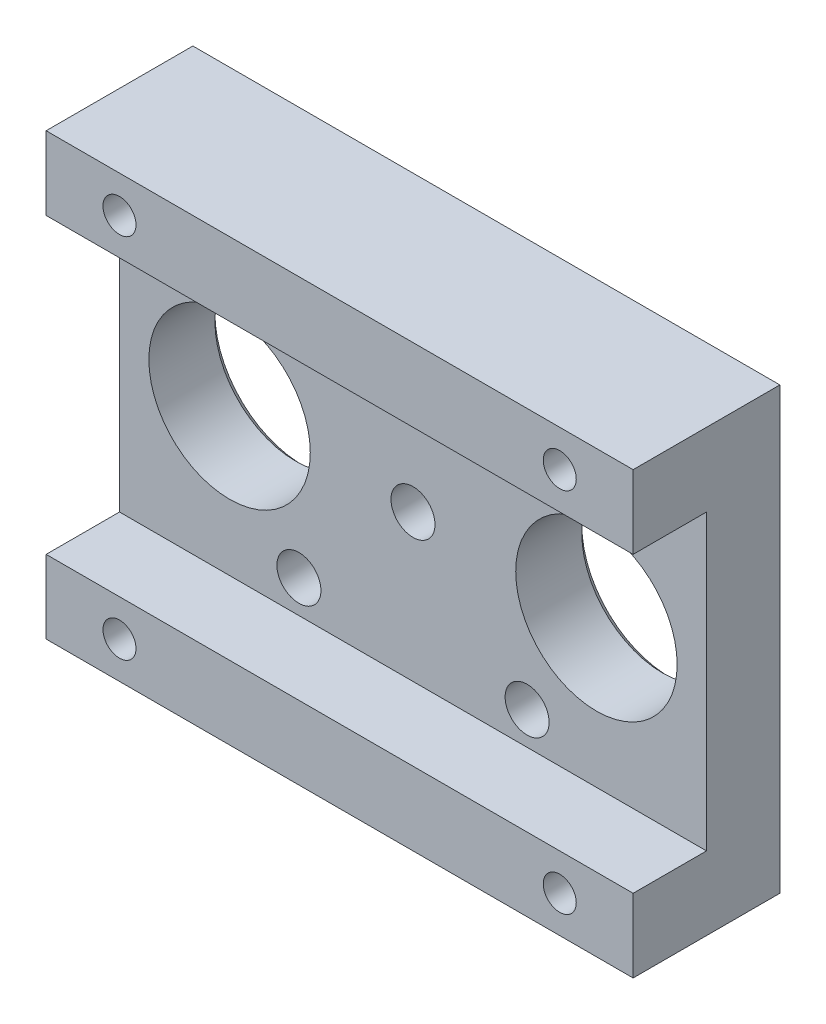
ISO-10303-21;
HEADER;
FILE_DESCRIPTION(('STEP AP214'),'2;1');
FILE_NAME('part.step','',(''),(''),'','','');
FILE_SCHEMA(('AUTOMOTIVE_DESIGN { 1 0 10303 214 1 1 1 1 }'));
ENDSEC;
DATA;
#1=APPLICATION_CONTEXT('core data for automotive mechanical design processes');
#2=APPLICATION_PROTOCOL_DEFINITION('international standard','automotive_design',2000,#1);
#3=PRODUCT_CONTEXT('',#1,'mechanical');
#4=PRODUCT('Part','Part','',(#3));
#5=PRODUCT_RELATED_PRODUCT_CATEGORY('part','',(#4));
#6=PRODUCT_DEFINITION_FORMATION('','',#4);
#7=PRODUCT_DEFINITION_CONTEXT('part definition',#1,'design');
#8=PRODUCT_DEFINITION('design','',#6,#7);
#9=PRODUCT_DEFINITION_SHAPE('','',#8);
#10=(LENGTH_UNIT() NAMED_UNIT(*) SI_UNIT(.MILLI.,.METRE.));
#11=(NAMED_UNIT(*) PLANE_ANGLE_UNIT() SI_UNIT($,.RADIAN.));
#12=(NAMED_UNIT(*) SI_UNIT($,.STERADIAN.) SOLID_ANGLE_UNIT());
#13=UNCERTAINTY_MEASURE_WITH_UNIT(LENGTH_MEASURE(1.E-05),#10,'distance_accuracy_value','');
#14=(GEOMETRIC_REPRESENTATION_CONTEXT(3) GLOBAL_UNCERTAINTY_ASSIGNED_CONTEXT((#13)) GLOBAL_UNIT_ASSIGNED_CONTEXT((#10,
#11,#12)) REPRESENTATION_CONTEXT('',''));
#15=CARTESIAN_POINT('',(0.,0.,0.));
#16=DIRECTION('',(0.,0.,1.));
#17=DIRECTION('',(1.,0.,0.));
#18=AXIS2_PLACEMENT_3D('',#15,#16,#17);
#19=CARTESIAN_POINT('',(-15.55,15.55,-2.2));
#20=DIRECTION('',(0.,0.,1.));
#21=DIRECTION('',(1.,0.,0.));
#22=AXIS2_PLACEMENT_3D('',#19,#20,#21);
#23=CYLINDRICAL_SURFACE('',#22,1.6);
#24=CARTESIAN_POINT('',(-15.55,15.55,0.));
#25=DIRECTION('',(0.,0.,1.));
#26=DIRECTION('',(1.,0.,0.));
#27=AXIS2_PLACEMENT_3D('',#24,#25,#26);
#28=CIRCLE('',#27,1.6);
#29=CARTESIAN_POINT('',(-13.95,15.55,0.));
#30=VERTEX_POINT('',#29);
#31=EDGE_CURVE('E206',#30,#30,#28,.T.);
#32=ORIENTED_EDGE('',*,*,#31,.F.);
#33=EDGE_LOOP('',(#32));
#34=FACE_BOUND('',#33,.T.);
#35=CARTESIAN_POINT('',(-15.55,15.55,4.));
#36=DIRECTION('',(0.,0.,1.));
#37=DIRECTION('',(1.,0.,0.));
#38=AXIS2_PLACEMENT_3D('',#35,#36,#37);
#39=CIRCLE('',#38,1.6);
#40=CARTESIAN_POINT('',(-13.95,15.55,4.));
#41=VERTEX_POINT('',#40);
#42=EDGE_CURVE('E211',#41,#41,#39,.F.);
#43=ORIENTED_EDGE('',*,*,#42,.F.);
#44=EDGE_LOOP('',(#43));
#45=FACE_BOUND('',#44,.T.);
#46=ADVANCED_FACE('F44',(#34,#45),#23,.F.);
#47=CARTESIAN_POINT('',(15.55,15.55,-2.2));
#48=DIRECTION('',(0.,0.,1.));
#49=DIRECTION('',(1.,0.,0.));
#50=AXIS2_PLACEMENT_3D('',#47,#48,#49);
#51=CYLINDRICAL_SURFACE('',#50,1.6);
#52=CARTESIAN_POINT('',(15.55,15.55,0.));
#53=DIRECTION('',(0.,0.,1.));
#54=DIRECTION('',(1.,0.,0.));
#55=AXIS2_PLACEMENT_3D('',#52,#53,#54);
#56=CIRCLE('',#55,1.6);
#57=CARTESIAN_POINT('',(17.15,15.55,0.));
#58=VERTEX_POINT('',#57);
#59=EDGE_CURVE('E210',#58,#58,#56,.T.);
#60=ORIENTED_EDGE('',*,*,#59,.F.);
#61=EDGE_LOOP('',(#60));
#62=FACE_BOUND('',#61,.T.);
#63=CARTESIAN_POINT('',(15.55,15.55,4.));
#64=DIRECTION('',(0.,0.,1.));
#65=DIRECTION('',(1.,0.,0.));
#66=AXIS2_PLACEMENT_3D('',#63,#64,#65);
#67=CIRCLE('',#66,1.6);
#68=CARTESIAN_POINT('',(17.15,15.55,4.));
#69=VERTEX_POINT('',#68);
#70=EDGE_CURVE('E233',#69,#69,#67,.F.);
#71=ORIENTED_EDGE('',*,*,#70,.F.);
#72=EDGE_LOOP('',(#71));
#73=FACE_BOUND('',#72,.T.);
#74=ADVANCED_FACE('F420',(#62,#73),#51,.F.);
#75=CARTESIAN_POINT('',(15.55,-15.55,-2.2));
#76=DIRECTION('',(0.,0.,1.));
#77=DIRECTION('',(1.,0.,0.));
#78=AXIS2_PLACEMENT_3D('',#75,#76,#77);
#79=CYLINDRICAL_SURFACE('',#78,1.6);
#80=CARTESIAN_POINT('',(15.55,-15.55,0.));
#81=DIRECTION('',(0.,0.,1.));
#82=DIRECTION('',(1.,0.,0.));
#83=AXIS2_PLACEMENT_3D('',#80,#81,#82);
#84=CIRCLE('',#83,1.6);
#85=CARTESIAN_POINT('',(17.15,-15.55,0.));
#86=VERTEX_POINT('',#85);
#87=EDGE_CURVE('E215',#86,#86,#84,.T.);
#88=ORIENTED_EDGE('',*,*,#87,.F.);
#89=EDGE_LOOP('',(#88));
#90=FACE_BOUND('',#89,.T.);
#91=CARTESIAN_POINT('',(15.55,-15.55,4.));
#92=DIRECTION('',(0.,0.,1.));
#93=DIRECTION('',(1.,0.,0.));
#94=AXIS2_PLACEMENT_3D('',#91,#92,#93);
#95=CIRCLE('',#94,1.6);
#96=CARTESIAN_POINT('',(17.15,-15.55,4.));
#97=VERTEX_POINT('',#96);
#98=EDGE_CURVE('E228',#97,#97,#95,.F.);
#99=ORIENTED_EDGE('',*,*,#98,.F.);
#100=EDGE_LOOP('',(#99));
#101=FACE_BOUND('',#100,.T.);
#102=ADVANCED_FACE('F426',(#90,#101),#79,.F.);
#103=CARTESIAN_POINT('',(-15.55,-15.55,-2.2));
#104=DIRECTION('',(0.,0.,1.));
#105=DIRECTION('',(1.,0.,0.));
#106=AXIS2_PLACEMENT_3D('',#103,#104,#105);
#107=CYLINDRICAL_SURFACE('',#106,1.6);
#108=CARTESIAN_POINT('',(-15.55,-15.55,0.));
#109=DIRECTION('',(0.,0.,1.));
#110=DIRECTION('',(1.,0.,0.));
#111=AXIS2_PLACEMENT_3D('',#108,#109,#110);
#112=CIRCLE('',#111,1.6);
#113=CARTESIAN_POINT('',(-13.95,-15.55,0.));
#114=VERTEX_POINT('',#113);
#115=EDGE_CURVE('E219',#114,#114,#112,.T.);
#116=ORIENTED_EDGE('',*,*,#115,.F.);
#117=EDGE_LOOP('',(#116));
#118=FACE_BOUND('',#117,.T.);
#119=CARTESIAN_POINT('',(-15.55,-15.55,4.));
#120=DIRECTION('',(0.,0.,1.));
#121=DIRECTION('',(1.,0.,0.));
#122=AXIS2_PLACEMENT_3D('',#119,#120,#121);
#123=CIRCLE('',#122,1.6);
#124=CARTESIAN_POINT('',(-13.95,-15.55,4.));
#125=VERTEX_POINT('',#124);
#126=EDGE_CURVE('E224',#125,#125,#123,.F.);
#127=ORIENTED_EDGE('',*,*,#126,.F.);
#128=EDGE_LOOP('',(#127));
#129=FACE_BOUND('',#128,.T.);
#130=ADVANCED_FACE('F385',(#118,#129),#107,.F.);
#131=CARTESIAN_POINT('',(0.,0.,10.));
#132=DIRECTION('',(0.,0.,1.));
#133=DIRECTION('',(1.,0.,0.));
#134=AXIS2_PLACEMENT_3D('',#131,#132,#133);
#135=PLANE('',#134);
#136=CARTESIAN_POINT('',(15.55,15.55,10.));
#137=DIRECTION('',(0.,0.,1.));
#138=DIRECTION('',(1.,0.,0.));
#139=AXIS2_PLACEMENT_3D('',#136,#137,#138);
#140=CIRCLE('',#139,3.);
#141=CARTESIAN_POINT('',(18.55,15.55,10.));
#142=VERTEX_POINT('',#141);
#143=EDGE_CURVE('E352',#142,#142,#140,.T.);
#144=ORIENTED_EDGE('',*,*,#143,.F.);
#145=EDGE_LOOP('',(#144));
#146=FACE_BOUND('',#145,.T.);
#147=CARTESIAN_POINT('',(-15.55,-15.55,10.));
#148=DIRECTION('',(0.,0.,1.));
#149=DIRECTION('',(1.,0.,0.));
#150=AXIS2_PLACEMENT_3D('',#147,#148,#149);
#151=CIRCLE('',#150,3.);
#152=CARTESIAN_POINT('',(-12.55,-15.55,10.));
#153=VERTEX_POINT('',#152);
#154=EDGE_CURVE('E360',#153,#153,#151,.T.);
#155=ORIENTED_EDGE('',*,*,#154,.F.);
#156=EDGE_LOOP('',(#155));
#157=FACE_BOUND('',#156,.T.);
#158=CARTESIAN_POINT('',(15.55,-15.55,10.));
#159=DIRECTION('',(0.,0.,1.));
#160=DIRECTION('',(1.,0.,0.));
#161=AXIS2_PLACEMENT_3D('',#158,#159,#160);
#162=CIRCLE('',#161,3.);
#163=CARTESIAN_POINT('',(18.55,-15.55,10.));
#164=VERTEX_POINT('',#163);
#165=EDGE_CURVE('E361',#164,#164,#162,.T.);
#166=ORIENTED_EDGE('',*,*,#165,.F.);
#167=EDGE_LOOP('',(#166));
#168=FACE_BOUND('',#167,.T.);
#169=CARTESIAN_POINT('',(-15.55,15.55,10.));
#170=DIRECTION('',(0.,0.,1.));
#171=DIRECTION('',(1.,0.,0.));
#172=AXIS2_PLACEMENT_3D('',#169,#170,#171);
#173=CIRCLE('',#172,3.);
#174=CARTESIAN_POINT('',(-12.55,15.55,10.));
#175=VERTEX_POINT('',#174);
#176=EDGE_CURVE('E348',#175,#175,#173,.T.);
#177=ORIENTED_EDGE('',*,*,#176,.F.);
#178=EDGE_LOOP('',(#177));
#179=FACE_BOUND('',#178,.T.);
#180=CARTESIAN_POINT('',(-25.,0.,10.));
#181=DIRECTION('',(0.,0.,1.));
#182=DIRECTION('',(1.,0.,0.));
#183=AXIS2_PLACEMENT_3D('',#180,#181,#182);
#184=CIRCLE('',#183,11.);
#185=CARTESIAN_POINT('',(-14.,0.,10.));
#186=VERTEX_POINT('',#185);
#187=EDGE_CURVE('E323',#186,#186,#184,.T.);
#188=ORIENTED_EDGE('',*,*,#187,.F.);
#189=EDGE_LOOP('',(#188));
#190=FACE_BOUND('',#189,.T.);
#191=CARTESIAN_POINT('',(25.,0.,10.));
#192=DIRECTION('',(0.,0.,1.));
#193=DIRECTION('',(1.,0.,0.));
#194=AXIS2_PLACEMENT_3D('',#191,#192,#193);
#195=CIRCLE('',#194,11.);
#196=CARTESIAN_POINT('',(36.,0.,10.));
#197=VERTEX_POINT('',#196);
#198=EDGE_CURVE('E223',#197,#197,#195,.T.);
#199=ORIENTED_EDGE('',*,*,#198,.F.);
#200=EDGE_LOOP('',(#199));
#201=FACE_BOUND('',#200,.T.);
#202=CARTESIAN_POINT('',(0.,0.,10.));
#203=DIRECTION('',(0.,0.,1.));
#204=DIRECTION('',(1.,0.,0.));
#205=AXIS2_PLACEMENT_3D('',#202,#203,#204);
#206=CIRCLE('',#205,3.);
#207=CARTESIAN_POINT('',(-3.,0.,10.));
#208=VERTEX_POINT('',#207);
#209=EDGE_CURVE('E200',#208,#208,#206,.T.);
#210=ORIENTED_EDGE('',*,*,#209,.F.);
#211=EDGE_LOOP('',(#210));
#212=FACE_BOUND('',#211,.T.);
#213=DIRECTION('',(0.,-1.,0.));
#214=VECTOR('',#213,1.);
#215=CARTESIAN_POINT('',(-40.,30.,10.));
#216=LINE('',#215,#214);
#217=CARTESIAN_POINT('',(-40.,20.,10.));
#218=VERTEX_POINT('',#217);
#219=CARTESIAN_POINT('',(-40.,-20.,10.));
#220=VERTEX_POINT('',#219);
#221=EDGE_CURVE('E66',#218,#220,#216,.T.);
#222=ORIENTED_EDGE('',*,*,#221,.T.);
#223=DIRECTION('',(-1.,0.,0.));
#224=VECTOR('',#223,1.);
#225=CARTESIAN_POINT('',(40.,-20.,10.));
#226=LINE('',#225,#224);
#227=CARTESIAN_POINT('',(40.,-20.,10.));
#228=VERTEX_POINT('',#227);
#229=EDGE_CURVE('E61',#228,#220,#226,.T.);
#230=ORIENTED_EDGE('',*,*,#229,.F.);
#231=DIRECTION('',(0.,1.,0.));
#232=VECTOR('',#231,1.);
#233=CARTESIAN_POINT('',(40.,30.,10.));
#234=LINE('',#233,#232);
#235=CARTESIAN_POINT('',(40.,20.,10.));
#236=VERTEX_POINT('',#235);
#237=EDGE_CURVE('E174',#228,#236,#234,.T.);
#238=ORIENTED_EDGE('',*,*,#237,.T.);
#239=DIRECTION('',(1.,0.,0.));
#240=VECTOR('',#239,1.);
#241=CARTESIAN_POINT('',(-40.,20.,10.));
#242=LINE('',#241,#240);
#243=EDGE_CURVE('E142',#218,#236,#242,.T.);
#244=ORIENTED_EDGE('',*,*,#243,.F.);
#245=EDGE_LOOP('',(#222,#230,#238,#244));
#246=FACE_BOUND('',#245,.T.);
#247=ADVANCED_FACE('F382',(#146,#157,#168,#179,#190,#201,#212,#246),#135,.T.);
#248=CARTESIAN_POINT('',(40.,30.,10.));
#249=DIRECTION('',(-1.,0.,0.));
#250=DIRECTION('',(0.,-1.,0.));
#251=AXIS2_PLACEMENT_3D('',#248,#249,#250);
#252=PLANE('',#251);
#253=DIRECTION('',(0.,1.,0.));
#254=VECTOR('',#253,1.);
#255=CARTESIAN_POINT('',(40.,30.,0.));
#256=LINE('',#255,#254);
#257=CARTESIAN_POINT('',(40.,-30.,0.));
#258=VERTEX_POINT('',#257);
#259=CARTESIAN_POINT('',(40.,30.,0.));
#260=VERTEX_POINT('',#259);
#261=EDGE_CURVE('E173',#258,#260,#256,.T.);
#262=ORIENTED_EDGE('',*,*,#261,.T.);
#263=DIRECTION('',(0.,0.,-1.));
#264=VECTOR('',#263,1.);
#265=CARTESIAN_POINT('',(40.,30.,10.));
#266=LINE('',#265,#264);
#267=CARTESIAN_POINT('',(40.,30.,20.));
#268=VERTEX_POINT('',#267);
#269=EDGE_CURVE('E195',#268,#260,#266,.T.);
#270=ORIENTED_EDGE('',*,*,#269,.F.);
#271=DIRECTION('',(0.,1.,0.));
#272=VECTOR('',#271,1.);
#273=CARTESIAN_POINT('',(40.,30.,20.));
#274=LINE('',#273,#272);
#275=CARTESIAN_POINT('',(40.,20.,20.));
#276=VERTEX_POINT('',#275);
#277=EDGE_CURVE('E154',#276,#268,#274,.T.);
#278=ORIENTED_EDGE('',*,*,#277,.F.);
#279=DIRECTION('',(0.,0.,-1.));
#280=VECTOR('',#279,1.);
#281=CARTESIAN_POINT('',(40.,20.,20.));
#282=LINE('',#281,#280);
#283=EDGE_CURVE('E162',#276,#236,#282,.T.);
#284=ORIENTED_EDGE('',*,*,#283,.T.);
#285=ORIENTED_EDGE('',*,*,#237,.F.);
#286=DIRECTION('',(0.,0.,-1.));
#287=VECTOR('',#286,1.);
#288=CARTESIAN_POINT('',(40.,-20.,20.));
#289=LINE('',#288,#287);
#290=CARTESIAN_POINT('',(40.,-20.,20.));
#291=VERTEX_POINT('',#290);
#292=EDGE_CURVE('E136',#291,#228,#289,.T.);
#293=ORIENTED_EDGE('',*,*,#292,.F.);
#294=DIRECTION('',(0.,1.,0.));
#295=VECTOR('',#294,1.);
#296=CARTESIAN_POINT('',(40.,-30.,20.));
#297=LINE('',#296,#295);
#298=CARTESIAN_POINT('',(40.,-30.,20.));
#299=VERTEX_POINT('',#298);
#300=EDGE_CURVE('E127',#299,#291,#297,.T.);
#301=ORIENTED_EDGE('',*,*,#300,.F.);
#302=DIRECTION('',(0.,0.,-1.));
#303=VECTOR('',#302,1.);
#304=CARTESIAN_POINT('',(40.,-30.,10.));
#305=LINE('',#304,#303);
#306=EDGE_CURVE('E109',#299,#258,#305,.T.);
#307=ORIENTED_EDGE('',*,*,#306,.T.);
#308=EDGE_LOOP('',(#262,#270,#278,#284,#285,#293,#301,#307));
#309=FACE_BOUND('',#308,.T.);
#310=ADVANCED_FACE('F134',(#309),#252,.F.);
#311=CARTESIAN_POINT('',(-40.,30.,10.));
#312=DIRECTION('',(0.,-1.,0.));
#313=DIRECTION('',(0.,0.,-1.));
#314=AXIS2_PLACEMENT_3D('',#311,#312,#313);
#315=PLANE('',#314);
#316=DIRECTION('',(-1.,0.,0.));
#317=VECTOR('',#316,1.);
#318=CARTESIAN_POINT('',(-40.,30.,0.));
#319=LINE('',#318,#317);
#320=CARTESIAN_POINT('',(-40.,30.,0.));
#321=VERTEX_POINT('',#320);
#322=EDGE_CURVE('E181',#260,#321,#319,.T.);
#323=ORIENTED_EDGE('',*,*,#322,.T.);
#324=DIRECTION('',(0.,0.,-1.));
#325=VECTOR('',#324,1.);
#326=CARTESIAN_POINT('',(-40.,30.,10.));
#327=LINE('',#326,#325);
#328=CARTESIAN_POINT('',(-40.,30.,20.));
#329=VERTEX_POINT('',#328);
#330=EDGE_CURVE('E191',#329,#321,#327,.T.);
#331=ORIENTED_EDGE('',*,*,#330,.F.);
#332=DIRECTION('',(-1.,0.,0.));
#333=VECTOR('',#332,1.);
#334=CARTESIAN_POINT('',(-40.,30.,20.));
#335=LINE('',#334,#333);
#336=EDGE_CURVE('E158',#268,#329,#335,.T.);
#337=ORIENTED_EDGE('',*,*,#336,.F.);
#338=ORIENTED_EDGE('',*,*,#269,.T.);
#339=EDGE_LOOP('',(#323,#331,#337,#338));
#340=FACE_BOUND('',#339,.T.);
#341=ADVANCED_FACE('F285',(#340),#315,.F.);
#342=CARTESIAN_POINT('',(-40.,30.,10.));
#343=DIRECTION('',(1.,0.,0.));
#344=DIRECTION('',(0.,1.,0.));
#345=AXIS2_PLACEMENT_3D('',#342,#343,#344);
#346=PLANE('',#345);
#347=DIRECTION('',(0.,-1.,0.));
#348=VECTOR('',#347,1.);
#349=CARTESIAN_POINT('',(-40.,30.,0.));
#350=LINE('',#349,#348);
#351=CARTESIAN_POINT('',(-40.,-30.,0.));
#352=VERTEX_POINT('',#351);
#353=EDGE_CURVE('E184',#321,#352,#350,.T.);
#354=ORIENTED_EDGE('',*,*,#353,.T.);
#355=DIRECTION('',(0.,0.,-1.));
#356=VECTOR('',#355,1.);
#357=CARTESIAN_POINT('',(-40.,-30.,10.));
#358=LINE('',#357,#356);
#359=CARTESIAN_POINT('',(-40.,-30.,20.));
#360=VERTEX_POINT('',#359);
#361=EDGE_CURVE('E121',#360,#352,#358,.T.);
#362=ORIENTED_EDGE('',*,*,#361,.F.);
#363=DIRECTION('',(0.,-1.,0.));
#364=VECTOR('',#363,1.);
#365=CARTESIAN_POINT('',(-40.,-30.,20.));
#366=LINE('',#365,#364);
#367=CARTESIAN_POINT('',(-40.,-20.,20.));
#368=VERTEX_POINT('',#367);
#369=EDGE_CURVE('E130',#368,#360,#366,.T.);
#370=ORIENTED_EDGE('',*,*,#369,.F.);
#371=DIRECTION('',(0.,0.,-1.));
#372=VECTOR('',#371,1.);
#373=CARTESIAN_POINT('',(-40.,-20.,20.));
#374=LINE('',#373,#372);
#375=EDGE_CURVE('E132',#368,#220,#374,.T.);
#376=ORIENTED_EDGE('',*,*,#375,.T.);
#377=ORIENTED_EDGE('',*,*,#221,.F.);
#378=DIRECTION('',(0.,0.,-1.));
#379=VECTOR('',#378,1.);
#380=CARTESIAN_POINT('',(-40.,20.,20.));
#381=LINE('',#380,#379);
#382=CARTESIAN_POINT('',(-40.,20.,20.));
#383=VERTEX_POINT('',#382);
#384=EDGE_CURVE('E169',#383,#218,#381,.T.);
#385=ORIENTED_EDGE('',*,*,#384,.F.);
#386=DIRECTION('',(0.,-1.,0.));
#387=VECTOR('',#386,1.);
#388=CARTESIAN_POINT('',(-40.,30.,20.));
#389=LINE('',#388,#387);
#390=EDGE_CURVE('E147',#329,#383,#389,.T.);
#391=ORIENTED_EDGE('',*,*,#390,.F.);
#392=ORIENTED_EDGE('',*,*,#330,.T.);
#393=EDGE_LOOP('',(#354,#362,#370,#376,#377,#385,#391,#392));
#394=FACE_BOUND('',#393,.T.);
#395=ADVANCED_FACE('F287',(#394),#346,.F.);
#396=CARTESIAN_POINT('',(-40.,-30.,10.));
#397=DIRECTION('',(0.,1.,0.));
#398=DIRECTION('',(0.,0.,1.));
#399=AXIS2_PLACEMENT_3D('',#396,#397,#398);
#400=PLANE('',#399);
#401=DIRECTION('',(1.,0.,0.));
#402=VECTOR('',#401,1.);
#403=CARTESIAN_POINT('',(-40.,-30.,0.));
#404=LINE('',#403,#402);
#405=EDGE_CURVE('E115',#352,#258,#404,.T.);
#406=ORIENTED_EDGE('',*,*,#405,.T.);
#407=ORIENTED_EDGE('',*,*,#306,.F.);
#408=DIRECTION('',(1.,0.,0.));
#409=VECTOR('',#408,1.);
#410=CARTESIAN_POINT('',(40.,-30.,20.));
#411=LINE('',#410,#409);
#412=EDGE_CURVE('E113',#360,#299,#411,.T.);
#413=ORIENTED_EDGE('',*,*,#412,.F.);
#414=ORIENTED_EDGE('',*,*,#361,.T.);
#415=EDGE_LOOP('',(#406,#407,#413,#414));
#416=FACE_BOUND('',#415,.T.);
#417=ADVANCED_FACE('F111',(#416),#400,.F.);
#418=CARTESIAN_POINT('',(0.,0.,0.));
#419=DIRECTION('',(0.,0.,1.));
#420=DIRECTION('',(1.,0.,0.));
#421=AXIS2_PLACEMENT_3D('',#418,#419,#420);
#422=PLANE('',#421);
#423=CARTESIAN_POINT('',(25.,0.,0.));
#424=DIRECTION('',(0.,0.,1.));
#425=DIRECTION('',(1.,0.,0.));
#426=AXIS2_PLACEMENT_3D('',#423,#424,#425);
#427=CIRCLE('',#426,12.);
#428=CARTESIAN_POINT('',(37.,0.,0.));
#429=VERTEX_POINT('',#428);
#430=EDGE_CURVE('E243',#429,#429,#427,.T.);
#431=ORIENTED_EDGE('',*,*,#430,.T.);
#432=EDGE_LOOP('',(#431));
#433=FACE_BOUND('',#432,.T.);
#434=CARTESIAN_POINT('',(-25.,0.,0.));
#435=DIRECTION('',(0.,0.,1.));
#436=DIRECTION('',(1.,0.,0.));
#437=AXIS2_PLACEMENT_3D('',#434,#435,#436);
#438=CIRCLE('',#437,12.);
#439=CARTESIAN_POINT('',(-13.,0.,0.));
#440=VERTEX_POINT('',#439);
#441=EDGE_CURVE('E199',#440,#440,#438,.T.);
#442=ORIENTED_EDGE('',*,*,#441,.T.);
#443=EDGE_LOOP('',(#442));
#444=FACE_BOUND('',#443,.T.);
#445=ORIENTED_EDGE('',*,*,#115,.T.);
#446=EDGE_LOOP('',(#445));
#447=FACE_BOUND('',#446,.T.);
#448=ORIENTED_EDGE('',*,*,#87,.T.);
#449=EDGE_LOOP('',(#448));
#450=FACE_BOUND('',#449,.T.);
#451=ORIENTED_EDGE('',*,*,#59,.T.);
#452=EDGE_LOOP('',(#451));
#453=FACE_BOUND('',#452,.T.);
#454=ORIENTED_EDGE('',*,*,#31,.T.);
#455=EDGE_LOOP('',(#454));
#456=FACE_BOUND('',#455,.T.);
#457=CARTESIAN_POINT('',(0.,0.,0.));
#458=DIRECTION('',(0.,0.,-1.));
#459=DIRECTION('',(-1.,0.,0.));
#460=AXIS2_PLACEMENT_3D('',#457,#458,#459);
#461=CIRCLE('',#460,11.35);
#462=CARTESIAN_POINT('',(-11.35,0.,0.));
#463=VERTEX_POINT('',#462);
#464=EDGE_CURVE('E204',#463,#463,#461,.T.);
#465=ORIENTED_EDGE('',*,*,#464,.F.);
#466=EDGE_LOOP('',(#465));
#467=FACE_BOUND('',#466,.T.);
#468=ORIENTED_EDGE('',*,*,#261,.F.);
#469=ORIENTED_EDGE('',*,*,#405,.F.);
#470=ORIENTED_EDGE('',*,*,#353,.F.);
#471=ORIENTED_EDGE('',*,*,#322,.F.);
#472=EDGE_LOOP('',(#468,#469,#470,#471));
#473=FACE_BOUND('',#472,.T.);
#474=ADVANCED_FACE('F259',(#433,#444,#447,#450,#453,#456,#467,#473),#422,.F.);
#475=CARTESIAN_POINT('',(-40.,20.,20.));
#476=DIRECTION('',(0.,1.,0.));
#477=DIRECTION('',(-1.,0.,0.));
#478=AXIS2_PLACEMENT_3D('',#475,#476,#477);
#479=PLANE('',#478);
#480=ORIENTED_EDGE('',*,*,#243,.T.);
#481=ORIENTED_EDGE('',*,*,#283,.F.);
#482=DIRECTION('',(1.,0.,0.));
#483=VECTOR('',#482,1.);
#484=CARTESIAN_POINT('',(-40.,20.,20.));
#485=LINE('',#484,#483);
#486=EDGE_CURVE('E151',#383,#276,#485,.T.);
#487=ORIENTED_EDGE('',*,*,#486,.F.);
#488=ORIENTED_EDGE('',*,*,#384,.T.);
#489=EDGE_LOOP('',(#480,#481,#487,#488));
#490=FACE_BOUND('',#489,.T.);
#491=ADVANCED_FACE('F262',(#490),#479,.F.);
#492=CARTESIAN_POINT('',(0.,0.,20.));
#493=DIRECTION('',(0.,0.,1.));
#494=DIRECTION('',(1.,0.,0.));
#495=AXIS2_PLACEMENT_3D('',#492,#493,#494);
#496=PLANE('',#495);
#497=CARTESIAN_POINT('',(-30.,25.,20.));
#498=DIRECTION('',(0.,0.,1.));
#499=DIRECTION('',(1.,0.,0.));
#500=AXIS2_PLACEMENT_3D('',#497,#498,#499);
#501=CIRCLE('',#500,2.25);
#502=CARTESIAN_POINT('',(-27.75,25.,20.));
#503=VERTEX_POINT('',#502);
#504=EDGE_CURVE('E314',#503,#503,#501,.T.);
#505=ORIENTED_EDGE('',*,*,#504,.F.);
#506=EDGE_LOOP('',(#505));
#507=FACE_BOUND('',#506,.T.);
#508=CARTESIAN_POINT('',(30.,25.,20.));
#509=DIRECTION('',(0.,0.,1.));
#510=DIRECTION('',(1.,0.,0.));
#511=AXIS2_PLACEMENT_3D('',#508,#509,#510);
#512=CIRCLE('',#511,2.25);
#513=CARTESIAN_POINT('',(32.25,25.,20.));
#514=VERTEX_POINT('',#513);
#515=EDGE_CURVE('E310',#514,#514,#512,.T.);
#516=ORIENTED_EDGE('',*,*,#515,.F.);
#517=EDGE_LOOP('',(#516));
#518=FACE_BOUND('',#517,.T.);
#519=ORIENTED_EDGE('',*,*,#390,.T.);
#520=ORIENTED_EDGE('',*,*,#486,.T.);
#521=ORIENTED_EDGE('',*,*,#277,.T.);
#522=ORIENTED_EDGE('',*,*,#336,.T.);
#523=EDGE_LOOP('',(#519,#520,#521,#522));
#524=FACE_BOUND('',#523,.T.);
#525=ADVANCED_FACE('F282',(#507,#518,#524),#496,.T.);
#526=CARTESIAN_POINT('',(40.,-20.,20.));
#527=DIRECTION('',(0.,-1.,0.));
#528=DIRECTION('',(1.,0.,0.));
#529=AXIS2_PLACEMENT_3D('',#526,#527,#528);
#530=PLANE('',#529);
#531=ORIENTED_EDGE('',*,*,#229,.T.);
#532=ORIENTED_EDGE('',*,*,#375,.F.);
#533=DIRECTION('',(-1.,0.,0.));
#534=VECTOR('',#533,1.);
#535=CARTESIAN_POINT('',(40.,-20.,20.));
#536=LINE('',#535,#534);
#537=EDGE_CURVE('E138',#291,#368,#536,.T.);
#538=ORIENTED_EDGE('',*,*,#537,.F.);
#539=ORIENTED_EDGE('',*,*,#292,.T.);
#540=EDGE_LOOP('',(#531,#532,#538,#539));
#541=FACE_BOUND('',#540,.T.);
#542=ADVANCED_FACE('F292',(#541),#530,.F.);
#543=CARTESIAN_POINT('',(0.,0.,20.));
#544=DIRECTION('',(0.,0.,1.));
#545=DIRECTION('',(1.,0.,0.));
#546=AXIS2_PLACEMENT_3D('',#543,#544,#545);
#547=PLANE('',#546);
#548=CARTESIAN_POINT('',(30.,-25.,20.));
#549=DIRECTION('',(0.,0.,1.));
#550=DIRECTION('',(1.,0.,0.));
#551=AXIS2_PLACEMENT_3D('',#548,#549,#550);
#552=CIRCLE('',#551,2.25);
#553=CARTESIAN_POINT('',(32.25,-25.,20.));
#554=VERTEX_POINT('',#553);
#555=EDGE_CURVE('E322',#554,#554,#552,.T.);
#556=ORIENTED_EDGE('',*,*,#555,.F.);
#557=EDGE_LOOP('',(#556));
#558=FACE_BOUND('',#557,.T.);
#559=CARTESIAN_POINT('',(-30.,-25.,20.));
#560=DIRECTION('',(0.,0.,1.));
#561=DIRECTION('',(1.,0.,0.));
#562=AXIS2_PLACEMENT_3D('',#559,#560,#561);
#563=CIRCLE('',#562,2.25);
#564=CARTESIAN_POINT('',(-27.75,-25.,20.));
#565=VERTEX_POINT('',#564);
#566=EDGE_CURVE('E331',#565,#565,#563,.T.);
#567=ORIENTED_EDGE('',*,*,#566,.F.);
#568=EDGE_LOOP('',(#567));
#569=FACE_BOUND('',#568,.T.);
#570=ORIENTED_EDGE('',*,*,#300,.T.);
#571=ORIENTED_EDGE('',*,*,#537,.T.);
#572=ORIENTED_EDGE('',*,*,#369,.T.);
#573=ORIENTED_EDGE('',*,*,#412,.T.);
#574=EDGE_LOOP('',(#570,#571,#572,#573));
#575=FACE_BOUND('',#574,.T.);
#576=ADVANCED_FACE('F126',(#558,#569,#575),#547,.T.);
#577=CARTESIAN_POINT('',(0.,0.,2.2));
#578=DIRECTION('',(0.,0.,-1.));
#579=DIRECTION('',(-1.,0.,0.));
#580=AXIS2_PLACEMENT_3D('',#577,#578,#579);
#581=CYLINDRICAL_SURFACE('',#580,11.35);
#582=CARTESIAN_POINT('',(0.,0.,2.2));
#583=DIRECTION('',(0.,0.,-1.));
#584=DIRECTION('',(-1.,0.,0.));
#585=AXIS2_PLACEMENT_3D('',#582,#583,#584);
#586=CIRCLE('',#585,11.35);
#587=CARTESIAN_POINT('',(-11.35,0.,2.2));
#588=VERTEX_POINT('',#587);
#589=EDGE_CURVE('E295',#588,#588,#586,.T.);
#590=ORIENTED_EDGE('',*,*,#589,.F.);
#591=EDGE_LOOP('',(#590));
#592=FACE_BOUND('',#591,.T.);
#593=ORIENTED_EDGE('',*,*,#464,.T.);
#594=EDGE_LOOP('',(#593));
#595=FACE_BOUND('',#594,.T.);
#596=ADVANCED_FACE('F406',(#592,#595),#581,.F.);
#597=CARTESIAN_POINT('',(0.,0.,2.2));
#598=DIRECTION('',(0.,0.,-1.));
#599=DIRECTION('',(-1.,0.,0.));
#600=AXIS2_PLACEMENT_3D('',#597,#598,#599);
#601=PLANE('',#600);
#602=CARTESIAN_POINT('',(0.,0.,2.2));
#603=DIRECTION('',(0.,0.,-1.));
#604=DIRECTION('',(-1.,0.,0.));
#605=AXIS2_PLACEMENT_3D('',#602,#603,#604);
#606=CIRCLE('',#605,3.);
#607=CARTESIAN_POINT('',(-3.,0.,2.2));
#608=VERTEX_POINT('',#607);
#609=EDGE_CURVE('E205',#608,#608,#606,.T.);
#610=ORIENTED_EDGE('',*,*,#609,.F.);
#611=EDGE_LOOP('',(#610));
#612=FACE_BOUND('',#611,.T.);
#613=ORIENTED_EDGE('',*,*,#589,.T.);
#614=EDGE_LOOP('',(#613));
#615=FACE_BOUND('',#614,.T.);
#616=ADVANCED_FACE('F400',(#612,#615),#601,.T.);
#617=CARTESIAN_POINT('',(0.,0.,14.4));
#618=DIRECTION('',(0.,0.,-1.));
#619=DIRECTION('',(-1.,0.,0.));
#620=AXIS2_PLACEMENT_3D('',#617,#618,#619);
#621=CYLINDRICAL_SURFACE('',#620,3.);
#622=CARTESIAN_POINT('',(-3.,0.,10.));
#623=CARTESIAN_POINT('',(-3.,0.,9.91875));
#624=CARTESIAN_POINT('',(-3.,0.,9.8375));
#625=CARTESIAN_POINT('',(-3.,0.,9.675));
#626=CARTESIAN_POINT('',(-3.,0.,9.59375));
#627=CARTESIAN_POINT('',(-3.,0.,9.43125));
#628=CARTESIAN_POINT('',(-3.,0.,9.35));
#629=CARTESIAN_POINT('',(-3.,0.,9.1875));
#630=CARTESIAN_POINT('',(-3.,0.,9.10625));
#631=CARTESIAN_POINT('',(-3.,0.,8.94375));
#632=CARTESIAN_POINT('',(-3.,0.,8.8625));
#633=CARTESIAN_POINT('',(-3.,0.,8.7));
#634=CARTESIAN_POINT('',(-3.,0.,8.61875));
#635=CARTESIAN_POINT('',(-3.,0.,8.45625));
#636=CARTESIAN_POINT('',(-3.,0.,8.375));
#637=CARTESIAN_POINT('',(-3.,0.,8.2125));
#638=CARTESIAN_POINT('',(-3.,0.,8.13125));
#639=CARTESIAN_POINT('',(-3.,0.,7.96875));
#640=CARTESIAN_POINT('',(-3.,0.,7.8875));
#641=CARTESIAN_POINT('',(-3.,0.,7.725));
#642=CARTESIAN_POINT('',(-3.,0.,7.64375));
#643=CARTESIAN_POINT('',(-3.,0.,7.48125));
#644=CARTESIAN_POINT('',(-3.,0.,7.4));
#645=CARTESIAN_POINT('',(-3.,0.,7.2375));
#646=CARTESIAN_POINT('',(-3.,0.,7.15625));
#647=CARTESIAN_POINT('',(-3.,0.,6.99375));
#648=CARTESIAN_POINT('',(-3.,0.,6.9125));
#649=CARTESIAN_POINT('',(-3.,0.,6.75));
#650=CARTESIAN_POINT('',(-3.,0.,6.66875));
#651=CARTESIAN_POINT('',(-3.,0.,6.50625));
#652=CARTESIAN_POINT('',(-3.,0.,6.425));
#653=CARTESIAN_POINT('',(-3.,0.,6.2625));
#654=CARTESIAN_POINT('',(-3.,0.,6.18125));
#655=CARTESIAN_POINT('',(-3.,0.,6.01875));
#656=CARTESIAN_POINT('',(-3.,0.,5.9375));
#657=CARTESIAN_POINT('',(-3.,0.,5.775));
#658=CARTESIAN_POINT('',(-3.,0.,5.69375));
#659=CARTESIAN_POINT('',(-3.,0.,5.53125));
#660=CARTESIAN_POINT('',(-3.,0.,5.45));
#661=CARTESIAN_POINT('',(-3.,0.,5.2875));
#662=CARTESIAN_POINT('',(-3.,0.,5.20625));
#663=CARTESIAN_POINT('',(-3.,0.,5.04375));
#664=CARTESIAN_POINT('',(-3.,0.,4.9625));
#665=CARTESIAN_POINT('',(-3.,0.,4.8));
#666=CARTESIAN_POINT('',(-3.,0.,4.71875));
#667=CARTESIAN_POINT('',(-3.,0.,4.55625));
#668=CARTESIAN_POINT('',(-3.,0.,4.475));
#669=CARTESIAN_POINT('',(-3.,0.,4.3125));
#670=CARTESIAN_POINT('',(-3.,0.,4.23125));
#671=CARTESIAN_POINT('',(-3.,0.,4.06875));
#672=CARTESIAN_POINT('',(-3.,0.,3.9875));
#673=CARTESIAN_POINT('',(-3.,0.,3.825));
#674=CARTESIAN_POINT('',(-3.,0.,3.74375));
#675=CARTESIAN_POINT('',(-3.,0.,3.58125));
#676=CARTESIAN_POINT('',(-3.,0.,3.5));
#677=CARTESIAN_POINT('',(-3.,0.,3.3375));
#678=CARTESIAN_POINT('',(-3.,0.,3.25625));
#679=CARTESIAN_POINT('',(-3.,0.,3.09375));
#680=CARTESIAN_POINT('',(-3.,0.,3.0125));
#681=CARTESIAN_POINT('',(-3.,0.,2.85));
#682=CARTESIAN_POINT('',(-3.,0.,2.76875));
#683=CARTESIAN_POINT('',(-3.,0.,2.60625));
#684=CARTESIAN_POINT('',(-3.,0.,2.525));
#685=CARTESIAN_POINT('',(-3.,0.,2.3625));
#686=CARTESIAN_POINT('',(-3.,0.,2.28125));
#687=CARTESIAN_POINT('',(-3.,0.,2.2));
#688=B_SPLINE_CURVE_WITH_KNOTS('',3,(#622,#623,#624,#625,#626,#627,#628,#629,#630,#631,#632,
#633,#634,#635,#636,#637,#638,#639,#640,#641,#642,#643,#644,#645,#646,#647,#648,#649,#650,#651,
#652,#653,#654,#655,#656,#657,#658,#659,#660,#661,#662,#663,#664,#665,#666,#667,#668,#669,#670,
#671,#672,#673,#674,#675,#676,#677,#678,#679,#680,#681,#682,#683,#684,#685,#686,#687),
.UNSPECIFIED.,.F.,.F.,(4,2,2,2,2,2,2,2,2,2,2,2,2,2,2,2,2,2,2,2,2,2,2,2,2,2,2,2,2,2,2,2,4),(0.,
0.243749999999999,0.487499999999998,0.731249999999999,0.975,1.21875,1.4625,1.70625,1.95,2.19375,
2.4375,2.68125,2.925,3.16875,3.4125,3.65625,3.9,4.14375,4.3875,4.63125,4.875,5.11875,5.3625,
5.60625,5.85,6.09375,6.3375,6.58125,6.825,7.06875,7.3125,7.55625,7.8),.UNSPECIFIED.);
#689=EDGE_CURVE('BSEAM396',#208,#608,#688,.T.);
#690=ORIENTED_EDGE('',*,*,#209,.T.);
#691=ORIENTED_EDGE('',*,*,#609,.T.);
#692=ORIENTED_EDGE('',*,*,#689,.T.);
#693=ORIENTED_EDGE('',*,*,#689,.F.);
#694=EDGE_LOOP('',(#690,#692,#691,#693));
#695=FACE_BOUND('',#694,.T.);
#696=ADVANCED_FACE('F396',(#695),#621,.F.);
#697=CARTESIAN_POINT('',(-30.,-25.,7.8));
#698=DIRECTION('',(0.,0.,1.));
#699=DIRECTION('',(1.,0.,0.));
#700=AXIS2_PLACEMENT_3D('',#697,#698,#699);
#701=CYLINDRICAL_SURFACE('',#700,2.25);
#702=CARTESIAN_POINT('',(-30.,-25.,7.8));
#703=DIRECTION('',(0.,0.,1.));
#704=DIRECTION('',(1.,0.,0.));
#705=AXIS2_PLACEMENT_3D('',#702,#703,#704);
#706=CIRCLE('',#705,2.25);
#707=CARTESIAN_POINT('',(-27.75,-25.,7.8));
#708=VERTEX_POINT('',#707);
#709=EDGE_CURVE('E327',#708,#708,#706,.T.);
#710=ORIENTED_EDGE('',*,*,#709,.F.);
#711=EDGE_LOOP('',(#710));
#712=FACE_BOUND('',#711,.T.);
#713=ORIENTED_EDGE('',*,*,#566,.T.);
#714=EDGE_LOOP('',(#713));
#715=FACE_BOUND('',#714,.T.);
#716=ADVANCED_FACE('F399',(#712,#715),#701,.F.);
#717=CARTESIAN_POINT('',(-30.,-25.,7.8));
#718=DIRECTION('',(0.,0.,1.));
#719=DIRECTION('',(1.,0.,0.));
#720=AXIS2_PLACEMENT_3D('',#717,#718,#719);
#721=PLANE('',#720);
#722=ORIENTED_EDGE('',*,*,#709,.T.);
#723=EDGE_LOOP('',(#722));
#724=FACE_BOUND('',#723,.T.);
#725=ADVANCED_FACE('F451',(#724),#721,.T.);
#726=CARTESIAN_POINT('',(30.,-25.,7.8));
#727=DIRECTION('',(0.,0.,1.));
#728=DIRECTION('',(1.,0.,0.));
#729=AXIS2_PLACEMENT_3D('',#726,#727,#728);
#730=CYLINDRICAL_SURFACE('',#729,2.25);
#731=CARTESIAN_POINT('',(30.,-25.,7.8));
#732=DIRECTION('',(0.,0.,1.));
#733=DIRECTION('',(1.,0.,0.));
#734=AXIS2_PLACEMENT_3D('',#731,#732,#733);
#735=CIRCLE('',#734,2.25);
#736=CARTESIAN_POINT('',(32.25,-25.,7.8));
#737=VERTEX_POINT('',#736);
#738=EDGE_CURVE('E318',#737,#737,#735,.T.);
#739=ORIENTED_EDGE('',*,*,#738,.F.);
#740=EDGE_LOOP('',(#739));
#741=FACE_BOUND('',#740,.T.);
#742=ORIENTED_EDGE('',*,*,#555,.T.);
#743=EDGE_LOOP('',(#742));
#744=FACE_BOUND('',#743,.T.);
#745=ADVANCED_FACE('F455',(#741,#744),#730,.F.);
#746=CARTESIAN_POINT('',(30.,-25.,7.8));
#747=DIRECTION('',(0.,0.,1.));
#748=DIRECTION('',(1.,0.,0.));
#749=AXIS2_PLACEMENT_3D('',#746,#747,#748);
#750=PLANE('',#749);
#751=ORIENTED_EDGE('',*,*,#738,.T.);
#752=EDGE_LOOP('',(#751));
#753=FACE_BOUND('',#752,.T.);
#754=ADVANCED_FACE('F459',(#753),#750,.T.);
#755=CARTESIAN_POINT('',(30.,25.,7.8));
#756=DIRECTION('',(0.,0.,1.));
#757=DIRECTION('',(1.,0.,0.));
#758=AXIS2_PLACEMENT_3D('',#755,#756,#757);
#759=CYLINDRICAL_SURFACE('',#758,2.25);
#760=CARTESIAN_POINT('',(30.,25.,7.8));
#761=DIRECTION('',(0.,0.,1.));
#762=DIRECTION('',(1.,0.,0.));
#763=AXIS2_PLACEMENT_3D('',#760,#761,#762);
#764=CIRCLE('',#763,2.25);
#765=CARTESIAN_POINT('',(32.25,25.,7.8));
#766=VERTEX_POINT('',#765);
#767=EDGE_CURVE('E309',#766,#766,#764,.T.);
#768=ORIENTED_EDGE('',*,*,#767,.F.);
#769=EDGE_LOOP('',(#768));
#770=FACE_BOUND('',#769,.T.);
#771=ORIENTED_EDGE('',*,*,#515,.T.);
#772=EDGE_LOOP('',(#771));
#773=FACE_BOUND('',#772,.T.);
#774=ADVANCED_FACE('F463',(#770,#773),#759,.F.);
#775=CARTESIAN_POINT('',(30.,25.,7.8));
#776=DIRECTION('',(0.,0.,1.));
#777=DIRECTION('',(1.,0.,0.));
#778=AXIS2_PLACEMENT_3D('',#775,#776,#777);
#779=PLANE('',#778);
#780=ORIENTED_EDGE('',*,*,#767,.T.);
#781=EDGE_LOOP('',(#780));
#782=FACE_BOUND('',#781,.T.);
#783=ADVANCED_FACE('F444',(#782),#779,.T.);
#784=CARTESIAN_POINT('',(-30.,25.,7.8));
#785=DIRECTION('',(0.,0.,1.));
#786=DIRECTION('',(1.,0.,0.));
#787=AXIS2_PLACEMENT_3D('',#784,#785,#786);
#788=CYLINDRICAL_SURFACE('',#787,2.25);
#789=CARTESIAN_POINT('',(-30.,25.,7.8));
#790=DIRECTION('',(0.,0.,1.));
#791=DIRECTION('',(1.,0.,0.));
#792=AXIS2_PLACEMENT_3D('',#789,#790,#791);
#793=CIRCLE('',#792,2.25);
#794=CARTESIAN_POINT('',(-27.75,25.,7.8));
#795=VERTEX_POINT('',#794);
#796=EDGE_CURVE('E335',#795,#795,#793,.T.);
#797=ORIENTED_EDGE('',*,*,#796,.F.);
#798=EDGE_LOOP('',(#797));
#799=FACE_BOUND('',#798,.T.);
#800=ORIENTED_EDGE('',*,*,#504,.T.);
#801=EDGE_LOOP('',(#800));
#802=FACE_BOUND('',#801,.T.);
#803=ADVANCED_FACE('F441',(#799,#802),#788,.F.);
#804=CARTESIAN_POINT('',(-30.,25.,7.8));
#805=DIRECTION('',(0.,0.,1.));
#806=DIRECTION('',(1.,0.,0.));
#807=AXIS2_PLACEMENT_3D('',#804,#805,#806);
#808=PLANE('',#807);
#809=ORIENTED_EDGE('',*,*,#796,.T.);
#810=EDGE_LOOP('',(#809));
#811=FACE_BOUND('',#810,.T.);
#812=ADVANCED_FACE('F440',(#811),#808,.T.);
#813=CARTESIAN_POINT('',(25.,0.,-2.2));
#814=DIRECTION('',(0.,0.,1.));
#815=DIRECTION('',(1.,0.,0.));
#816=AXIS2_PLACEMENT_3D('',#813,#814,#815);
#817=CYLINDRICAL_SURFACE('',#816,11.);
#818=CARTESIAN_POINT('',(25.,0.,0.999999999999989));
#819=DIRECTION('',(0.,0.,1.));
#820=DIRECTION('',(1.,0.,0.));
#821=AXIS2_PLACEMENT_3D('',#818,#819,#820);
#822=CIRCLE('',#821,11.);
#823=CARTESIAN_POINT('',(36.,0.,0.999999999999989));
#824=VERTEX_POINT('',#823);
#825=EDGE_CURVE('E54',#824,#824,#822,.F.);
#826=ORIENTED_EDGE('',*,*,#825,.T.);
#827=EDGE_LOOP('',(#826));
#828=FACE_BOUND('',#827,.T.);
#829=ORIENTED_EDGE('',*,*,#198,.T.);
#830=EDGE_LOOP('',(#829));
#831=FACE_BOUND('',#830,.T.);
#832=ADVANCED_FACE('F250',(#828,#831),#817,.F.);
#833=CARTESIAN_POINT('',(-25.,0.,-2.2));
#834=DIRECTION('',(0.,0.,1.));
#835=DIRECTION('',(1.,0.,0.));
#836=AXIS2_PLACEMENT_3D('',#833,#834,#835);
#837=CYLINDRICAL_SURFACE('',#836,11.);
#838=CARTESIAN_POINT('',(-25.,0.,0.999999999999987));
#839=DIRECTION('',(0.,0.,1.));
#840=DIRECTION('',(1.,0.,0.));
#841=AXIS2_PLACEMENT_3D('',#838,#839,#840);
#842=CIRCLE('',#841,11.);
#843=CARTESIAN_POINT('',(-14.,0.,0.999999999999987));
#844=VERTEX_POINT('',#843);
#845=EDGE_CURVE('E11',#844,#844,#842,.F.);
#846=ORIENTED_EDGE('',*,*,#845,.T.);
#847=EDGE_LOOP('',(#846));
#848=FACE_BOUND('',#847,.T.);
#849=ORIENTED_EDGE('',*,*,#187,.T.);
#850=EDGE_LOOP('',(#849));
#851=FACE_BOUND('',#850,.T.);
#852=ADVANCED_FACE('F433',(#848,#851),#837,.F.);
#853=CARTESIAN_POINT('',(-15.55,-15.55,4.));
#854=DIRECTION('',(0.,0.,1.));
#855=DIRECTION('',(1.,0.,0.));
#856=AXIS2_PLACEMENT_3D('',#853,#854,#855);
#857=PLANE('',#856);
#858=CARTESIAN_POINT('',(-15.55,-15.55,4.));
#859=DIRECTION('',(0.,0.,1.));
#860=DIRECTION('',(1.,0.,0.));
#861=AXIS2_PLACEMENT_3D('',#858,#859,#860);
#862=CIRCLE('',#861,3.);
#863=CARTESIAN_POINT('',(-12.55,-15.55,4.));
#864=VERTEX_POINT('',#863);
#865=EDGE_CURVE('E356',#864,#864,#862,.T.);
#866=ORIENTED_EDGE('',*,*,#865,.T.);
#867=EDGE_LOOP('',(#866));
#868=FACE_BOUND('',#867,.T.);
#869=ORIENTED_EDGE('',*,*,#126,.T.);
#870=EDGE_LOOP('',(#869));
#871=FACE_BOUND('',#870,.T.);
#872=ADVANCED_FACE('F436',(#868,#871),#857,.T.);
#873=CARTESIAN_POINT('',(-15.55,-15.55,4.));
#874=DIRECTION('',(0.,0.,1.));
#875=DIRECTION('',(1.,0.,0.));
#876=AXIS2_PLACEMENT_3D('',#873,#874,#875);
#877=CYLINDRICAL_SURFACE('',#876,3.);
#878=ORIENTED_EDGE('',*,*,#865,.F.);
#879=EDGE_LOOP('',(#878));
#880=FACE_BOUND('',#879,.T.);
#881=ORIENTED_EDGE('',*,*,#154,.T.);
#882=EDGE_LOOP('',(#881));
#883=FACE_BOUND('',#882,.T.);
#884=ADVANCED_FACE('F660',(#880,#883),#877,.F.);
#885=CARTESIAN_POINT('',(15.55,-15.55,4.));
#886=DIRECTION('',(0.,0.,1.));
#887=DIRECTION('',(1.,0.,0.));
#888=AXIS2_PLACEMENT_3D('',#885,#886,#887);
#889=PLANE('',#888);
#890=CARTESIAN_POINT('',(15.55,-15.55,4.));
#891=DIRECTION('',(0.,0.,1.));
#892=DIRECTION('',(1.,0.,0.));
#893=AXIS2_PLACEMENT_3D('',#890,#891,#892);
#894=CIRCLE('',#893,3.);
#895=CARTESIAN_POINT('',(18.55,-15.55,4.));
#896=VERTEX_POINT('',#895);
#897=EDGE_CURVE('E372',#896,#896,#894,.T.);
#898=ORIENTED_EDGE('',*,*,#897,.T.);
#899=EDGE_LOOP('',(#898));
#900=FACE_BOUND('',#899,.T.);
#901=ORIENTED_EDGE('',*,*,#98,.T.);
#902=EDGE_LOOP('',(#901));
#903=FACE_BOUND('',#902,.T.);
#904=ADVANCED_FACE('F670',(#900,#903),#889,.T.);
#905=CARTESIAN_POINT('',(15.55,-15.55,4.));
#906=DIRECTION('',(0.,0.,1.));
#907=DIRECTION('',(1.,0.,0.));
#908=AXIS2_PLACEMENT_3D('',#905,#906,#907);
#909=CYLINDRICAL_SURFACE('',#908,3.);
#910=ORIENTED_EDGE('',*,*,#897,.F.);
#911=EDGE_LOOP('',(#910));
#912=FACE_BOUND('',#911,.T.);
#913=ORIENTED_EDGE('',*,*,#165,.T.);
#914=EDGE_LOOP('',(#913));
#915=FACE_BOUND('',#914,.T.);
#916=ADVANCED_FACE('F380',(#912,#915),#909,.F.);
#917=CARTESIAN_POINT('',(15.55,15.55,4.));
#918=DIRECTION('',(0.,0.,1.));
#919=DIRECTION('',(1.,0.,0.));
#920=AXIS2_PLACEMENT_3D('',#917,#918,#919);
#921=PLANE('',#920);
#922=CARTESIAN_POINT('',(15.55,15.55,4.));
#923=DIRECTION('',(0.,0.,1.));
#924=DIRECTION('',(1.,0.,0.));
#925=AXIS2_PLACEMENT_3D('',#922,#923,#924);
#926=CIRCLE('',#925,3.);
#927=CARTESIAN_POINT('',(18.55,15.55,4.));
#928=VERTEX_POINT('',#927);
#929=EDGE_CURVE('E365',#928,#928,#926,.T.);
#930=ORIENTED_EDGE('',*,*,#929,.T.);
#931=EDGE_LOOP('',(#930));
#932=FACE_BOUND('',#931,.T.);
#933=ORIENTED_EDGE('',*,*,#70,.T.);
#934=EDGE_LOOP('',(#933));
#935=FACE_BOUND('',#934,.T.);
#936=ADVANCED_FACE('F691',(#932,#935),#921,.T.);
#937=CARTESIAN_POINT('',(15.55,15.55,4.));
#938=DIRECTION('',(0.,0.,1.));
#939=DIRECTION('',(1.,0.,0.));
#940=AXIS2_PLACEMENT_3D('',#937,#938,#939);
#941=CYLINDRICAL_SURFACE('',#940,3.);
#942=ORIENTED_EDGE('',*,*,#929,.F.);
#943=EDGE_LOOP('',(#942));
#944=FACE_BOUND('',#943,.T.);
#945=ORIENTED_EDGE('',*,*,#143,.T.);
#946=EDGE_LOOP('',(#945));
#947=FACE_BOUND('',#946,.T.);
#948=ADVANCED_FACE('F702',(#944,#947),#941,.F.);
#949=CARTESIAN_POINT('',(-15.55,15.55,4.));
#950=DIRECTION('',(0.,0.,1.));
#951=DIRECTION('',(1.,0.,0.));
#952=AXIS2_PLACEMENT_3D('',#949,#950,#951);
#953=PLANE('',#952);
#954=CARTESIAN_POINT('',(-15.55,15.55,4.));
#955=DIRECTION('',(0.,0.,1.));
#956=DIRECTION('',(1.,0.,0.));
#957=AXIS2_PLACEMENT_3D('',#954,#955,#956);
#958=CIRCLE('',#957,3.);
#959=CARTESIAN_POINT('',(-12.55,15.55,4.));
#960=VERTEX_POINT('',#959);
#961=EDGE_CURVE('E229',#960,#960,#958,.T.);
#962=ORIENTED_EDGE('',*,*,#961,.T.);
#963=EDGE_LOOP('',(#962));
#964=FACE_BOUND('',#963,.T.);
#965=ORIENTED_EDGE('',*,*,#42,.T.);
#966=EDGE_LOOP('',(#965));
#967=FACE_BOUND('',#966,.T.);
#968=ADVANCED_FACE('F713',(#964,#967),#953,.T.);
#969=CARTESIAN_POINT('',(-15.55,15.55,4.));
#970=DIRECTION('',(0.,0.,1.));
#971=DIRECTION('',(1.,0.,0.));
#972=AXIS2_PLACEMENT_3D('',#969,#970,#971);
#973=CYLINDRICAL_SURFACE('',#972,3.);
#974=ORIENTED_EDGE('',*,*,#961,.F.);
#975=EDGE_LOOP('',(#974));
#976=FACE_BOUND('',#975,.T.);
#977=ORIENTED_EDGE('',*,*,#176,.T.);
#978=EDGE_LOOP('',(#977));
#979=FACE_BOUND('',#978,.T.);
#980=ADVANCED_FACE('F256',(#976,#979),#973,.F.);
#981=CARTESIAN_POINT('',(25.,0.,0.));
#982=DIRECTION('',(0.,0.,-1.));
#983=DIRECTION('',(-1.,0.,0.));
#984=AXIS2_PLACEMENT_3D('',#981,#982,#983);
#985=CONICAL_SURFACE('',#984,12.,0.785398163397447);
#986=ORIENTED_EDGE('',*,*,#825,.F.);
#987=EDGE_LOOP('',(#986));
#988=FACE_BOUND('',#987,.T.);
#989=ORIENTED_EDGE('',*,*,#430,.F.);
#990=EDGE_LOOP('',(#989));
#991=FACE_BOUND('',#990,.T.);
#992=ADVANCED_FACE('F253',(#988,#991),#985,.F.);
#993=CARTESIAN_POINT('',(-25.,0.,0.));
#994=DIRECTION('',(0.,0.,-1.));
#995=DIRECTION('',(-1.,0.,0.));
#996=AXIS2_PLACEMENT_3D('',#993,#994,#995);
#997=CONICAL_SURFACE('',#996,12.,0.785398163397447);
#998=ORIENTED_EDGE('',*,*,#845,.F.);
#999=EDGE_LOOP('',(#998));
#1000=FACE_BOUND('',#999,.T.);
#1001=ORIENTED_EDGE('',*,*,#441,.F.);
#1002=EDGE_LOOP('',(#1001));
#1003=FACE_BOUND('',#1002,.T.);
#1004=ADVANCED_FACE('F47',(#1000,#1003),#997,.F.);
#1005=CLOSED_SHELL('',(#46,#74,#102,#130,#247,#310,#341,#395,#417,#474,#491,#525,#542,#576,#596,
#616,#696,#716,#725,#745,#754,#774,#783,#803,#812,#832,#852,#872,#884,#904,#916,#936,#948,#968,
#980,#992,#1004));
#1006=MANIFOLD_SOLID_BREP('B2',#1005);
#1007=ADVANCED_BREP_SHAPE_REPRESENTATION('',(#18,#1006),#14);
#1008=SHAPE_DEFINITION_REPRESENTATION(#9,#1007);
ENDSEC;
END-ISO-10303-21;
